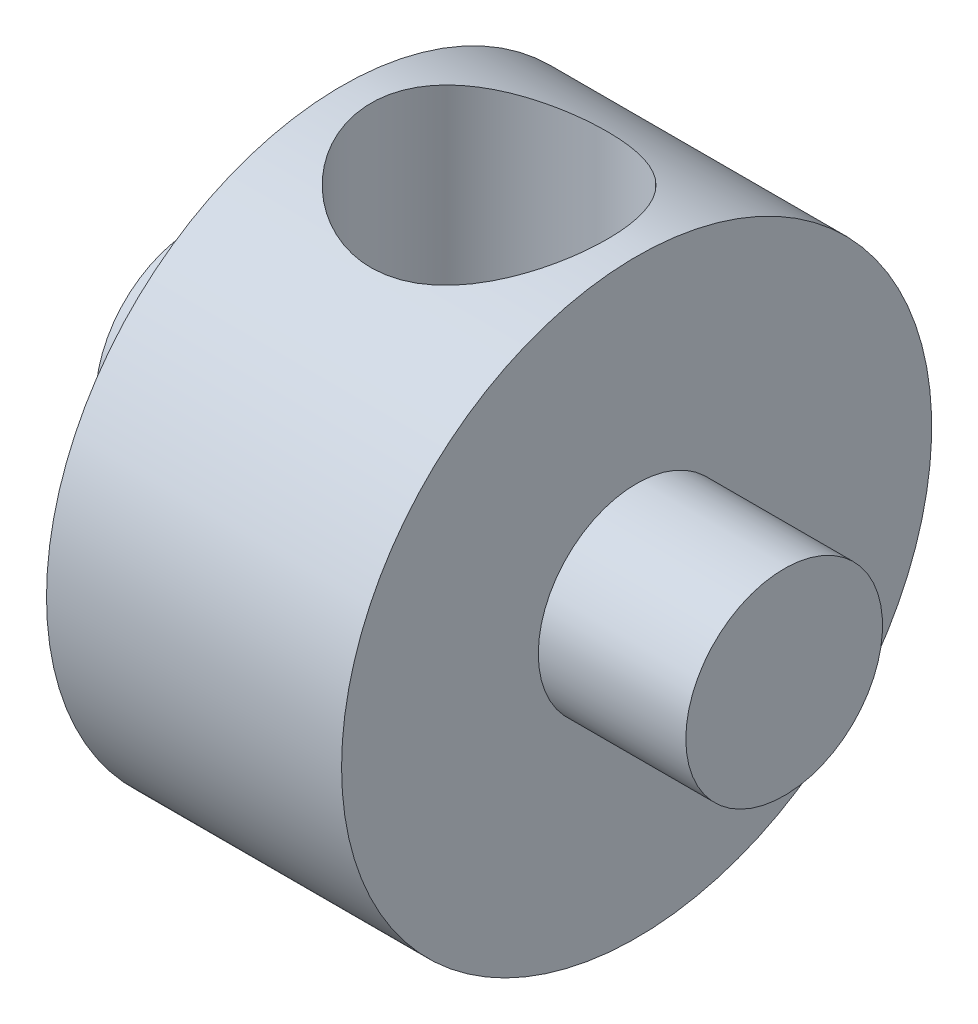
ISO-10303-21;
HEADER;
FILE_DESCRIPTION(('STEP AP214'),'2;1');
FILE_NAME('part.step','',(''),(''),'','','');
FILE_SCHEMA(('AUTOMOTIVE_DESIGN { 1 0 10303 214 1 1 1 1 }'));
ENDSEC;
DATA;
#1=APPLICATION_CONTEXT('core data for automotive mechanical design processes');
#2=APPLICATION_PROTOCOL_DEFINITION('international standard','automotive_design',2000,#1);
#3=PRODUCT_CONTEXT('',#1,'mechanical');
#4=PRODUCT('Part','Part','',(#3));
#5=PRODUCT_RELATED_PRODUCT_CATEGORY('part','',(#4));
#6=PRODUCT_DEFINITION_FORMATION('','',#4);
#7=PRODUCT_DEFINITION_CONTEXT('part definition',#1,'design');
#8=PRODUCT_DEFINITION('design','',#6,#7);
#9=PRODUCT_DEFINITION_SHAPE('','',#8);
#10=(LENGTH_UNIT() NAMED_UNIT(*) SI_UNIT(.MILLI.,.METRE.));
#11=(NAMED_UNIT(*) PLANE_ANGLE_UNIT() SI_UNIT($,.RADIAN.));
#12=(NAMED_UNIT(*) SI_UNIT($,.STERADIAN.) SOLID_ANGLE_UNIT());
#13=UNCERTAINTY_MEASURE_WITH_UNIT(LENGTH_MEASURE(1.E-05),#10,'distance_accuracy_value','');
#14=(GEOMETRIC_REPRESENTATION_CONTEXT(3) GLOBAL_UNCERTAINTY_ASSIGNED_CONTEXT((#13)) GLOBAL_UNIT_ASSIGNED_CONTEXT((#10,
#11,#12)) REPRESENTATION_CONTEXT('',''));
#15=CARTESIAN_POINT('',(0.,0.,0.));
#16=DIRECTION('',(0.,0.,1.));
#17=DIRECTION('',(1.,0.,0.));
#18=AXIS2_PLACEMENT_3D('',#15,#16,#17);
#19=CARTESIAN_POINT('',(9.525,0.,0.));
#20=DIRECTION('',(-1.,0.,0.));
#21=DIRECTION('',(0.,0.,1.));
#22=AXIS2_PLACEMENT_3D('',#19,#20,#21);
#23=PLANE('',#22);
#24=CARTESIAN_POINT('',(9.525,0.,0.));
#25=DIRECTION('',(-1.,0.,0.));
#26=DIRECTION('',(0.,0.,1.));
#27=AXIS2_PLACEMENT_3D('',#24,#25,#26);
#28=CIRCLE('',#27,3.175);
#29=CARTESIAN_POINT('',(9.525,0.,3.175));
#30=VERTEX_POINT('',#29);
#31=EDGE_CURVE('E55',#30,#30,#28,.T.);
#32=ORIENTED_EDGE('',*,*,#31,.F.);
#33=EDGE_LOOP('',(#32));
#34=FACE_BOUND('',#33,.T.);
#35=ADVANCED_FACE('F38',(#34),#23,.F.);
#36=CARTESIAN_POINT('',(-4.7625,0.,0.));
#37=DIRECTION('',(-1.,0.,0.));
#38=DIRECTION('',(0.,0.,1.));
#39=AXIS2_PLACEMENT_3D('',#36,#37,#38);
#40=CYLINDRICAL_SURFACE('',#39,3.175);
#41=ORIENTED_EDGE('',*,*,#31,.T.);
#42=EDGE_LOOP('',(#41));
#43=FACE_BOUND('',#42,.T.);
#44=CARTESIAN_POINT('',(4.7625,0.,0.));
#45=DIRECTION('',(-1.,0.,0.));
#46=DIRECTION('',(0.,0.,1.));
#47=AXIS2_PLACEMENT_3D('',#44,#45,#46);
#48=CIRCLE('',#47,3.175);
#49=CARTESIAN_POINT('',(4.7625,0.,3.175));
#50=VERTEX_POINT('',#49);
#51=EDGE_CURVE('E60',#50,#50,#48,.T.);
#52=ORIENTED_EDGE('',*,*,#51,.F.);
#53=EDGE_LOOP('',(#52));
#54=FACE_BOUND('',#53,.T.);
#55=ADVANCED_FACE('F93',(#43,#54),#40,.T.);
#56=CARTESIAN_POINT('',(4.7625,0.,0.));
#57=DIRECTION('',(-1.,0.,0.));
#58=DIRECTION('',(0.,0.,1.));
#59=AXIS2_PLACEMENT_3D('',#56,#57,#58);
#60=PLANE('',#59);
#61=CARTESIAN_POINT('',(4.7625,0.,0.));
#62=DIRECTION('',(-1.,0.,0.));
#63=DIRECTION('',(0.,0.,1.));
#64=AXIS2_PLACEMENT_3D('',#61,#62,#63);
#65=CIRCLE('',#64,9.525);
#66=CARTESIAN_POINT('',(4.7625,0.,9.525));
#67=VERTEX_POINT('',#66);
#68=EDGE_CURVE('E105',#67,#67,#65,.T.);
#69=ORIENTED_EDGE('',*,*,#68,.F.);
#70=EDGE_LOOP('',(#69));
#71=FACE_BOUND('',#70,.T.);
#72=ORIENTED_EDGE('',*,*,#51,.T.);
#73=EDGE_LOOP('',(#72));
#74=FACE_BOUND('',#73,.T.);
#75=ADVANCED_FACE('F88',(#71,#74),#60,.F.);
#76=CARTESIAN_POINT('',(-4.7625,0.,0.));
#77=DIRECTION('',(-1.,0.,0.));
#78=DIRECTION('',(0.,0.,1.));
#79=AXIS2_PLACEMENT_3D('',#76,#77,#78);
#80=CYLINDRICAL_SURFACE('',#79,9.525);
#81=CARTESIAN_POINT('',(-3.81,-9.525,0.));
#82=CARTESIAN_POINT('',(-3.80999849987639,-9.5249989224488,-0.102440976231623));
#83=CARTESIAN_POINT('',(-3.80586265329616,-9.52334264397829,-0.204913370913194));
#84=CARTESIAN_POINT('',(-3.78935610289831,-9.51675840508281,-0.409132278523444));
#85=CARTESIAN_POINT('',(-3.77698020313399,-9.51182838033035,-0.510878292474894));
#86=CARTESIAN_POINT('',(-3.7440793470906,-9.49881171316012,-0.713075653313788));
#87=CARTESIAN_POINT('',(-3.72353676047462,-9.49071824209817,-0.813523710554927));
#88=CARTESIAN_POINT('',(-3.67451475175898,-9.47159348894025,-1.01219089961094));
#89=CARTESIAN_POINT('',(-3.64603211014184,-9.46056101522412,-1.11040910976465));
#90=CARTESIAN_POINT('',(-3.54927902469805,-9.42355029334501,-1.39997982971218));
#91=CARTESIAN_POINT('',(-3.4695557173964,-9.39359747050944,-1.58714224857547));
#92=CARTESIAN_POINT('',(-3.28227097797433,-9.3260516635062,-1.94517090528892));
#93=CARTESIAN_POINT('',(-3.17471920924055,-9.28846133242165,-2.116042771876));
#94=CARTESIAN_POINT('',(-2.92944351131809,-9.2074538864882,-2.44506121291144));
#95=CARTESIAN_POINT('',(-2.79062239317673,-9.16385589202486,-2.60234642661349));
#96=CARTESIAN_POINT('',(-2.48907241978269,-9.07657385447313,-2.89212558778383));
#97=CARTESIAN_POINT('',(-2.32633193703674,-9.03288977978737,-3.02460740639748));
#98=CARTESIAN_POINT('',(-1.9727646899406,-8.94821922244206,-3.26683542157924));
#99=CARTESIAN_POINT('',(-1.78101028792429,-8.90743931947678,-3.37530737090675));
#100=CARTESIAN_POINT('',(-1.38010311723218,-8.83603096856888,-3.55807290795635));
#101=CARTESIAN_POINT('',(-1.17095866797632,-8.80539770102307,-3.63238272905151));
#102=CARTESIAN_POINT('',(-0.751118015459272,-8.7596921159956,-3.74122721648166));
#103=CARTESIAN_POINT('',(-0.540922399146063,-8.74397705834745,-3.77741299360784));
#104=CARTESIAN_POINT('',(-0.116900325307342,-8.72802427656331,-3.81413950317063));
#105=CARTESIAN_POINT('',(0.0969242949855826,-8.72777894147226,-3.81469776400507));
#106=CARTESIAN_POINT('',(0.50626645846757,-8.74224503008922,-3.7814047423704));
#107=CARTESIAN_POINT('',(0.702022435899281,-8.75591673304197,-3.74994547296304));
#108=CARTESIAN_POINT('',(1.0852014545137,-8.79493137240415,-3.65749880763356));
#109=CARTESIAN_POINT('',(1.27262303543171,-8.82027634531426,-3.59650625928578));
#110=CARTESIAN_POINT('',(1.63833397785808,-8.88033819135657,-3.44556346532811));
#111=CARTESIAN_POINT('',(1.81635890037356,-8.91523577541187,-3.35504763766187));
#112=CARTESIAN_POINT('',(2.15534713019442,-8.99042111711451,-3.14802480774369));
#113=CARTESIAN_POINT('',(2.31630399591945,-9.03071089692167,-3.03150804373064));
#114=CARTESIAN_POINT('',(2.62968053336015,-9.11593433497397,-2.76520389194611));
#115=CARTESIAN_POINT('',(2.78047842959261,-9.16098621780473,-2.61354086695515));
#116=CARTESIAN_POINT('',(3.05501893059594,-9.24800966544623,-2.28659898425843));
#117=CARTESIAN_POINT('',(3.17875614706716,-9.28998061568099,-2.11131543446315));
#118=CARTESIAN_POINT('',(3.39779123732659,-9.36716467809214,-1.73750792821305));
#119=CARTESIAN_POINT('',(3.49247894568023,-9.40222789531832,-1.53859323601476));
#120=CARTESIAN_POINT('',(3.64648977535385,-9.46051247966219,-1.12590027324517));
#121=CARTESIAN_POINT('',(3.70583086154692,-9.48373986145821,-0.912129614998678));
#122=CARTESIAN_POINT('',(3.78418400277449,-9.51463945760682,-0.489386665892851));
#123=CARTESIAN_POINT('',(3.80537552535298,-9.5231511181285,-0.280879475042512));
#124=CARTESIAN_POINT('',(3.81326345650706,-9.52630451562747,0.13686531518396));
#125=CARTESIAN_POINT('',(3.79996880634817,-9.5209498477426,0.346102711191895));
#126=CARTESIAN_POINT('',(3.7408642113883,-9.49752165256455,0.749489368027082));
#127=CARTESIAN_POINT('',(3.69654204743084,-9.48003040513238,0.943894146831149));
#128=CARTESIAN_POINT('',(3.57866497567035,-9.43469235877462,1.32232799045692));
#129=CARTESIAN_POINT('',(3.50510631273321,-9.40684422964132,1.50635571898255));
#130=CARTESIAN_POINT('',(3.32844468990759,-9.34243613038457,1.86514508697647));
#131=CARTESIAN_POINT('',(3.22450687574982,-9.30563574441755,2.03945113333259));
#132=CARTESIAN_POINT('',(2.99096368296773,-9.22731259839996,2.36876004134115));
#133=CARTESIAN_POINT('',(2.86134801826225,-9.1857879487421,2.52375512671147));
#134=CARTESIAN_POINT('',(2.57009262529916,-9.09913949101515,2.82077739690431));
#135=CARTESIAN_POINT('',(2.40690360330834,-9.05395905918233,2.96127284364826));
#136=CARTESIAN_POINT('',(2.0584666419895,-8.96762886903628,3.21326103132546));
#137=CARTESIAN_POINT('',(1.87321507481003,-8.92647977564879,3.32474899279177));
#138=CARTESIAN_POINT('',(1.48311547133616,-8.85280741337437,3.51626329022679));
#139=CARTESIAN_POINT('',(1.27809497976807,-8.82037156885208,3.59597437901507));
#140=CARTESIAN_POINT('',(0.855852395213826,-8.7691659792581,3.71912430210902));
#141=CARTESIAN_POINT('',(0.638639434388178,-8.75038614915582,3.7625899073629));
#142=CARTESIAN_POINT('',(0.215021341123582,-8.73007701638321,3.80945823854939));
#143=CARTESIAN_POINT('',(0.00896330894497964,-8.72740357640901,3.81551889717792));
#144=CARTESIAN_POINT('',(-0.401087932316889,-8.73661262022796,3.79438506302706));
#145=CARTESIAN_POINT('',(-0.605081400276556,-8.74849325569786,3.76719479301511));
#146=CARTESIAN_POINT('',(-0.99694789899801,-8.78446268713173,3.68250079304943));
#147=CARTESIAN_POINT('',(-1.18513940602559,-8.80805012754279,3.6262383411179));
#148=CARTESIAN_POINT('',(-1.54948600610469,-8.86442214223055,3.4861609636716));
#149=CARTESIAN_POINT('',(-1.72563775881853,-8.89720925610887,3.40233842900159));
#150=CARTESIAN_POINT('',(-2.07189744120079,-8.97061883317214,3.20396531040936));
#151=CARTESIAN_POINT('',(-2.24108184373065,-9.01158243473822,3.08793014232532));
#152=CARTESIAN_POINT('',(-2.55839799085013,-9.09568424624993,2.83063331102816));
#153=CARTESIAN_POINT('',(-2.7065233657937,-9.13882310881654,2.68936404438073));
#154=CARTESIAN_POINT('',(-2.98744347188539,-9.22579733901769,2.37455785355481));
#155=CARTESIAN_POINT('',(-3.11862157324315,-9.26949652545165,2.19952268761037));
#156=CARTESIAN_POINT('',(-3.29188582376299,-9.32969013813547,1.92135046808195));
#157=CARTESIAN_POINT('',(-3.34575822831994,-9.34887579382255,1.82593775628734));
#158=CARTESIAN_POINT('',(-3.44522869062353,-9.38493330464201,1.63049055710812));
#159=CARTESIAN_POINT('',(-3.49083053719213,-9.40180621839401,1.53045821250654));
#160=CARTESIAN_POINT('',(-3.57258745541243,-9.43247033385552,1.32830551176372));
#161=CARTESIAN_POINT('',(-3.60889882239667,-9.44631186552185,1.22625590221918));
#162=CARTESIAN_POINT('',(-3.67276508370449,-9.47089536077218,1.01913287591022));
#163=CARTESIAN_POINT('',(-3.70032406112578,-9.48163876945297,0.914060894143367));
#164=CARTESIAN_POINT('',(-3.74634903143195,-9.49969522443553,0.701940318103635));
#165=CARTESIAN_POINT('',(-3.76483808084183,-9.50701696663355,0.594897461070694));
#166=CARTESIAN_POINT('',(-3.79260598855958,-9.51804705078325,0.379494223618241));
#167=CARTESIAN_POINT('',(-3.80189139305969,-9.52175796094387,0.27113483520545));
#168=CARTESIAN_POINT('',(-3.80884356553371,-9.52453752204469,0.108423516412781));
#169=CARTESIAN_POINT('',(-3.81000079392975,-9.52500057028632,0.0542161583294644));
#170=CARTESIAN_POINT('',(-3.81,-9.525,0.));
#171=B_SPLINE_CURVE_WITH_KNOTS('',3,(#81,#82,#83,#84,#85,#86,#87,#88,#89,#90,#91,#92,#93,#94,
#95,#96,#97,#98,#99,#100,#101,#102,#103,#104,#105,#106,#107,#108,#109,#110,#111,#112,#113,#114,
#115,#116,#117,#118,#119,#120,#121,#122,#123,#124,#125,#126,#127,#128,#129,#130,#131,#132,#133,
#134,#135,#136,#137,#138,#139,#140,#141,#142,#143,#144,#145,#146,#147,#148,#149,#150,#151,#152,
#153,#154,#155,#156,#157,#158,#159,#160,#161,#162,#163,#164,#165,#166,#167,#168,#169,#170),
.UNSPECIFIED.,.T.,.F.,(4,2,2,2,2,2,2,2,2,2,2,2,2,2,2,2,2,2,2,2,2,2,2,2,2,2,2,2,2,2,2,2,2,2,2,2,
2,2,2,2,2,2,2,2,4),(0.,0.307280303734602,0.614754553559123,0.922896218533851,1.23116301036172,
1.84500701024997,2.45863813923671,3.09861580515917,3.73890560726715,4.40769136427269,
5.07615899416961,5.71430888989979,6.3521448195529,6.94559083985629,7.53914043107687,
8.14480353984161,8.75069442177156,9.40342223585308,10.0562799024461,10.7220358796006,
11.3874531978169,12.0134786491077,12.6393418063592,13.2370843623503,13.834903717181,
14.4510086140861,15.0673608123045,15.7244051254442,16.3815576291326,17.0450762937819,
17.7081044477542,18.323419461981,18.9386563411752,19.5295634522032,20.1206338459375,
20.7455468503292,21.3706484695361,22.0362787521687,22.3696457863586,22.7028597140185,
23.0300318536648,23.3570511385031,23.6832347482393,24.009186189509,24.1718121055403),.UNSPECIFIED.);
#172=CARTESIAN_POINT('',(-3.81,-9.525,0.));
#173=VERTEX_POINT('',#172);
#174=EDGE_CURVE('E10',#173,#173,#171,.T.);
#175=ORIENTED_EDGE('',*,*,#174,.F.);
#176=EDGE_LOOP('',(#175));
#177=FACE_BOUND('',#176,.T.);
#178=CARTESIAN_POINT('',(0.,8.72980669889088,3.81));
#179=CARTESIAN_POINT('',(0.102086565687126,8.72980747738187,3.80999921891842));
#180=CARTESIAN_POINT('',(0.204204436454541,8.7316035302612,3.80589117768837));
#181=CARTESIAN_POINT('',(0.407700569697559,8.73872925778658,3.7895003379036));
#182=CARTESIAN_POINT('',(0.509078341072914,8.7440610952037,3.7772125359297));
#183=CARTESIAN_POINT('',(0.710503995571135,8.75809537381811,3.74455713217613));
#184=CARTESIAN_POINT('',(0.810548815318375,8.76680453120531,3.72417342879634));
#185=CARTESIAN_POINT('',(1.00839993632325,8.78730252503843,3.67554450191172));
#186=CARTESIAN_POINT('',(1.10620528990442,8.79909263998481,3.64729601444972));
#187=CARTESIAN_POINT('',(1.39445021461373,8.83844020491973,3.55139604474048));
#188=CARTESIAN_POINT('',(1.58070986971852,8.87004966709332,3.47242664764833));
#189=CARTESIAN_POINT('',(1.93719570841099,8.94044610819544,3.28691801772329));
#190=CARTESIAN_POINT('',(2.10742538181141,8.97923151940491,3.18038480469522));
#191=CARTESIAN_POINT('',(2.43698250245534,9.06210097781532,2.93622055267926));
#192=CARTESIAN_POINT('',(2.59528668770775,9.10635550256901,2.79726326441719));
#193=CARTESIAN_POINT('',(2.88708503865993,9.19376744003837,2.49499525834792));
#194=CARTESIAN_POINT('',(3.0205705343691,9.23692446483325,2.33167606589396));
#195=CARTESIAN_POINT('',(3.26403853461983,9.31932488247285,1.97740218795191));
#196=CARTESIAN_POINT('',(3.37288672002086,9.35834684996793,1.7856117240819));
#197=CARTESIAN_POINT('',(3.55633717199229,9.42601483158086,1.38460219550477));
#198=CARTESIAN_POINT('',(3.63095337381016,9.45466506684765,1.17539026382774));
#199=CARTESIAN_POINT('',(3.74016548827512,9.49715508886746,0.756221054229137));
#200=CARTESIAN_POINT('',(3.77652402173815,9.51164474489123,0.54679021902106));
#201=CARTESIAN_POINT('',(3.81386427678453,9.52652991918456,0.124332353087548));
#202=CARTESIAN_POINT('',(3.81485919307989,9.52693069423268,-0.0886933066711247));
#203=CARTESIAN_POINT('',(3.7824103207245,9.5139883915877,-0.499552901702397));
#204=CARTESIAN_POINT('',(3.750897807152,9.50141603845793,-0.697568047529192));
#205=CARTESIAN_POINT('',(3.65761357139316,9.464979002526,-1.08522727325679));
#206=CARTESIAN_POINT('',(3.5958396289334,9.44111349115205,-1.27487073781632));
#207=CARTESIAN_POINT('',(3.44302749991139,9.3839695059041,-1.64382057281083));
#208=CARTESIAN_POINT('',(3.3515622932215,9.3505545868787,-1.82292807252289));
#209=CARTESIAN_POINT('',(3.14236416187422,9.27762784768709,-2.16371452717611));
#210=CARTESIAN_POINT('',(3.02462223415941,9.23811393928998,-2.32538748038155));
#211=CARTESIAN_POINT('',(2.75720339601067,9.15393718820429,-2.6379846173172));
#212=CARTESIAN_POINT('',(2.60593733464446,9.10910662004878,-2.78750619523124));
#213=CARTESIAN_POINT('',(2.28030296066439,9.02134964154089,-3.0596346263241));
#214=CARTESIAN_POINT('',(2.10592711618855,8.97842385810392,-3.1822326699145));
#215=CARTESIAN_POINT('',(1.73275176237643,8.89819589564183,-3.40024247950991));
#216=CARTESIAN_POINT('',(1.53340149820454,8.86108681279931,-3.494788511367));
#217=CARTESIAN_POINT('',(1.11972949095554,8.79895859605483,-3.64841077504569));
#218=CARTESIAN_POINT('',(0.905417573095929,8.77393161182948,-3.70751004441008));
#219=CARTESIAN_POINT('',(0.481896843924457,8.74070692233674,-3.78514917756856));
#220=CARTESIAN_POINT('',(0.273176148220084,8.73157448098942,-3.8059463444317));
#221=CARTESIAN_POINT('',(-0.144927080781948,8.72850993440518,-3.8129743268737));
#222=CARTESIAN_POINT('',(-0.354309394140151,8.7345732196749,-3.7992156246764));
#223=CARTESIAN_POINT('',(-0.75525427109295,8.76025764504111,-3.739577664575));
#224=CARTESIAN_POINT('',(-0.947152545746999,8.77908692105765,-3.69557248315545));
#225=CARTESIAN_POINT('',(-1.32071441111641,8.82719947207082,-3.57912197606522));
#226=CARTESIAN_POINT('',(-1.50237572226957,8.85648506490779,-3.50667034434587));
#227=CARTESIAN_POINT('',(-1.85852249160026,8.92366354443494,-3.33210339321236));
#228=CARTESIAN_POINT('',(-2.03241818946133,8.96185732337635,-3.22890426404401));
#229=CARTESIAN_POINT('',(-2.36121509107798,9.04208983725597,-2.99687975256181));
#230=CARTESIAN_POINT('',(-2.51610851768191,9.08413013426956,-2.86804393398354));
#231=CARTESIAN_POINT('',(-2.81439634337473,9.17106844925558,-2.57716822325093));
#232=CARTESIAN_POINT('',(-2.9560962568532,9.21594817878407,-2.41337864309134));
#233=CARTESIAN_POINT('',(-3.21026233096892,9.3005870865111,-2.06327432156922));
#234=CARTESIAN_POINT('',(-3.32272730166584,9.3403460562478,-1.87695866378718));
#235=CARTESIAN_POINT('',(-3.51481572831055,9.41038978790385,-1.48643327426745));
#236=CARTESIAN_POINT('',(-3.59444704776974,9.44067681788991,-1.28222784127166));
#237=CARTESIAN_POINT('',(-3.71770056420242,9.48828519157729,-0.861809790723142));
#238=CARTESIAN_POINT('',(-3.7613423036085,9.50561357138139,-0.645603757692744));
#239=CARTESIAN_POINT('',(-3.80905645532025,9.52460010645449,-0.222535452132904));
#240=CARTESIAN_POINT('',(-3.81552474010314,9.52720688064992,-0.0159838881118233));
#241=CARTESIAN_POINT('',(-3.79503531658128,9.51901910715213,0.395161456793926));
#242=CARTESIAN_POINT('',(-3.7680826681113,9.5082265880737,0.599755529312004));
#243=CARTESIAN_POINT('',(-3.68322835151231,9.47492733016673,0.994735569210882));
#244=CARTESIAN_POINT('',(-3.62630279642894,9.45279060820881,1.18536492654433));
#245=CARTESIAN_POINT('',(-3.48414446861816,9.3991737540751,1.55433208212595));
#246=CARTESIAN_POINT('',(-3.39890647491668,9.3676918987177,1.73266760599179));
#247=CARTESIAN_POINT('',(-3.19829816819109,9.29674470583298,2.08064680910122));
#248=CARTESIAN_POINT('',(-3.08176274924843,9.25698805283235,2.24955814157398));
#249=CARTESIAN_POINT('',(-2.82361378033657,9.17427809917919,2.56613786960793));
#250=CARTESIAN_POINT('',(-2.68198985060277,9.13132347972609,2.71379742675579));
#251=CARTESIAN_POINT('',(-2.36731088748035,9.04375452093767,2.99313862724399));
#252=CARTESIAN_POINT('',(-2.1928528354863,8.99920205160159,3.12326526431714));
#253=CARTESIAN_POINT('',(-1.82320909051159,8.91634576107669,3.35250855878603));
#254=CARTESIAN_POINT('',(-1.62802096417044,8.87804267480121,3.45162157030556));
#255=CARTESIAN_POINT('',(-1.24003694354996,8.81555800361856,3.60805586195513));
#256=CARTESIAN_POINT('',(-1.04859993866157,8.79041725048609,3.66833057302889));
#257=CARTESIAN_POINT('',(-0.755676390799332,8.76191001465829,3.73565387079997));
#258=CARTESIAN_POINT('',(-0.657155433310597,8.75394430278663,3.75424114668035));
#259=CARTESIAN_POINT('',(-0.458765024545633,8.74129443325385,3.78360480272399));
#260=CARTESIAN_POINT('',(-0.358896390350386,8.73660837091746,3.79438571660285));
#261=CARTESIAN_POINT('',(-0.215693061736828,8.73236450840805,3.80413481078378));
#262=CARTESIAN_POINT('',(-0.172593161618112,8.73140614474182,3.80633343140281));
#263=CARTESIAN_POINT('',(-0.0863307097855826,8.730127052012,3.80926624483991));
#264=CARTESIAN_POINT('',(-0.043168153710334,8.72980636969948,3.81000033028684));
#265=CARTESIAN_POINT('',(0.,8.72980669889088,3.81));
#266=B_SPLINE_CURVE_WITH_KNOTS('',3,(#178,#179,#180,#181,#182,#183,#184,#185,#186,#187,#188,
#189,#190,#191,#192,#193,#194,#195,#196,#197,#198,#199,#200,#201,#202,#203,#204,#205,#206,#207,
#208,#209,#210,#211,#212,#213,#214,#215,#216,#217,#218,#219,#220,#221,#222,#223,#224,#225,#226,
#227,#228,#229,#230,#231,#232,#233,#234,#235,#236,#237,#238,#239,#240,#241,#242,#243,#244,#245,
#246,#247,#248,#249,#250,#251,#252,#253,#254,#255,#256,#257,#258,#259,#260,#261,#262,#263,#264,
#265),.UNSPECIFIED.,.T.,.F.,(4,2,2,2,2,2,2,2,2,2,2,2,2,2,2,2,2,2,2,2,2,2,2,2,2,2,2,2,2,2,2,2,2,
2,2,2,2,2,2,2,2,2,2,4),(0.,0.30621549437983,0.61261846784341,0.919633909654752,1.22677695609031,
1.83807904972284,2.44924775044349,3.09211265966723,3.73520172268485,4.40364897754064,
5.07182387711753,5.70765031534978,6.34323951442199,6.94312781536619,7.54306013655752,
8.15203425082374,8.76121733595653,9.41039617109876,10.0597871071207,10.7275210699127,
11.3948205877909,12.0213530416891,12.6476954653452,13.2383642073709,13.8291639636626,
14.4439226274829,15.0589320630664,15.7193692687539,16.3798333517938,17.040139164658,
17.7000861932752,18.3169759386998,18.933772300164,19.5316221254948,20.1295822589835,
20.7539664555645,21.3786095818971,22.0419217564399,22.7053118788615,23.3091355199523,
23.6105627780589,23.9118148349693,24.0412911125356,24.1707768821949),.UNSPECIFIED.);
#267=CARTESIAN_POINT('',(0.,8.72980669889088,3.81));
#268=VERTEX_POINT('',#267);
#269=EDGE_CURVE('E50',#268,#268,#266,.T.);
#270=ORIENTED_EDGE('',*,*,#269,.F.);
#271=EDGE_LOOP('',(#270));
#272=FACE_BOUND('',#271,.T.);
#273=ORIENTED_EDGE('',*,*,#68,.T.);
#274=EDGE_LOOP('',(#273));
#275=FACE_BOUND('',#274,.T.);
#276=CARTESIAN_POINT('',(-4.7625,0.,0.));
#277=DIRECTION('',(-1.,0.,0.));
#278=DIRECTION('',(0.,0.,1.));
#279=AXIS2_PLACEMENT_3D('',#276,#277,#278);
#280=CIRCLE('',#279,9.525);
#281=CARTESIAN_POINT('',(-4.7625,0.,9.525));
#282=VERTEX_POINT('',#281);
#283=EDGE_CURVE('E108',#282,#282,#280,.T.);
#284=ORIENTED_EDGE('',*,*,#283,.F.);
#285=EDGE_LOOP('',(#284));
#286=FACE_BOUND('',#285,.T.);
#287=ADVANCED_FACE('F66',(#177,#272,#275,#286),#80,.T.);
#288=CARTESIAN_POINT('',(-4.7625,0.,0.));
#289=DIRECTION('',(-1.,0.,0.));
#290=DIRECTION('',(0.,0.,1.));
#291=AXIS2_PLACEMENT_3D('',#288,#289,#290);
#292=PLANE('',#291);
#293=ORIENTED_EDGE('',*,*,#283,.T.);
#294=EDGE_LOOP('',(#293));
#295=FACE_BOUND('',#294,.T.);
#296=CARTESIAN_POINT('',(-4.7625,0.,0.));
#297=DIRECTION('',(-1.,0.,0.));
#298=DIRECTION('',(0.,0.,1.));
#299=AXIS2_PLACEMENT_3D('',#296,#297,#298);
#300=CIRCLE('',#299,3.175);
#301=CARTESIAN_POINT('',(-4.7625,0.,3.175));
#302=VERTEX_POINT('',#301);
#303=EDGE_CURVE('E113',#302,#302,#300,.T.);
#304=ORIENTED_EDGE('',*,*,#303,.F.);
#305=EDGE_LOOP('',(#304));
#306=FACE_BOUND('',#305,.T.);
#307=ADVANCED_FACE('F81',(#295,#306),#292,.T.);
#308=CARTESIAN_POINT('',(-4.7625,0.,0.));
#309=DIRECTION('',(-1.,0.,0.));
#310=DIRECTION('',(0.,0.,1.));
#311=AXIS2_PLACEMENT_3D('',#308,#309,#310);
#312=CYLINDRICAL_SURFACE('',#311,3.175);
#313=CARTESIAN_POINT('',(-9.525,0.,0.));
#314=DIRECTION('',(-1.,0.,0.));
#315=DIRECTION('',(0.,0.,1.));
#316=AXIS2_PLACEMENT_3D('',#313,#314,#315);
#317=CIRCLE('',#316,3.175);
#318=CARTESIAN_POINT('',(-9.525,0.,3.175));
#319=VERTEX_POINT('',#318);
#320=EDGE_CURVE('E117',#319,#319,#317,.T.);
#321=ORIENTED_EDGE('',*,*,#320,.F.);
#322=EDGE_LOOP('',(#321));
#323=FACE_BOUND('',#322,.T.);
#324=ORIENTED_EDGE('',*,*,#303,.T.);
#325=EDGE_LOOP('',(#324));
#326=FACE_BOUND('',#325,.T.);
#327=ADVANCED_FACE('F78',(#323,#326),#312,.T.);
#328=CARTESIAN_POINT('',(-9.525,0.,0.));
#329=DIRECTION('',(-1.,0.,0.));
#330=DIRECTION('',(0.,0.,1.));
#331=AXIS2_PLACEMENT_3D('',#328,#329,#330);
#332=PLANE('',#331);
#333=ORIENTED_EDGE('',*,*,#320,.T.);
#334=EDGE_LOOP('',(#333));
#335=FACE_BOUND('',#334,.T.);
#336=ADVANCED_FACE('F74',(#335),#332,.T.);
#337=CARTESIAN_POINT('',(0.,-9.525,0.));
#338=DIRECTION('',(0.,1.,0.));
#339=DIRECTION('',(0.,0.,1.));
#340=AXIS2_PLACEMENT_3D('',#337,#338,#339);
#341=CYLINDRICAL_SURFACE('',#340,3.81);
#342=ORIENTED_EDGE('',*,*,#174,.T.);
#343=EDGE_LOOP('',(#342));
#344=FACE_BOUND('',#343,.T.);
#345=ORIENTED_EDGE('',*,*,#269,.T.);
#346=EDGE_LOOP('',(#345));
#347=FACE_BOUND('',#346,.T.);
#348=ADVANCED_FACE('F70',(#344,#347),#341,.F.);
#349=CLOSED_SHELL('',(#35,#55,#75,#287,#307,#327,#336,#348));
#350=MANIFOLD_SOLID_BREP('B2',#349);
#351=ADVANCED_BREP_SHAPE_REPRESENTATION('',(#18,#350),#14);
#352=SHAPE_DEFINITION_REPRESENTATION(#9,#351);
ENDSEC;
END-ISO-10303-21;
